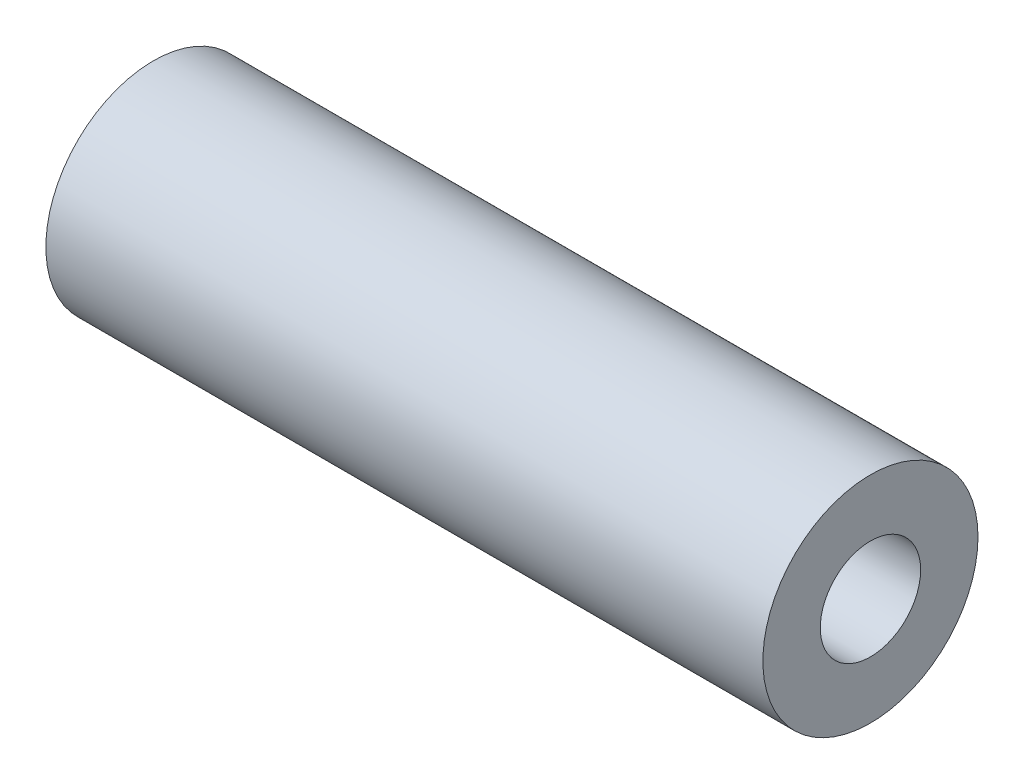
ISO-10303-21;
HEADER;
FILE_DESCRIPTION(('STEP AP214'),'2;1');
FILE_NAME('part.step','',(''),(''),'','','');
FILE_SCHEMA(('AUTOMOTIVE_DESIGN { 1 0 10303 214 1 1 1 1 }'));
ENDSEC;
DATA;
#1=APPLICATION_CONTEXT('core data for automotive mechanical design processes');
#2=APPLICATION_PROTOCOL_DEFINITION('international standard','automotive_design',2000,#1);
#3=PRODUCT_CONTEXT('',#1,'mechanical');
#4=PRODUCT('Part','Part','',(#3));
#5=PRODUCT_RELATED_PRODUCT_CATEGORY('part','',(#4));
#6=PRODUCT_DEFINITION_FORMATION('','',#4);
#7=PRODUCT_DEFINITION_CONTEXT('part definition',#1,'design');
#8=PRODUCT_DEFINITION('design','',#6,#7);
#9=PRODUCT_DEFINITION_SHAPE('','',#8);
#10=(LENGTH_UNIT() NAMED_UNIT(*) SI_UNIT(.MILLI.,.METRE.));
#11=(NAMED_UNIT(*) PLANE_ANGLE_UNIT() SI_UNIT($,.RADIAN.));
#12=(NAMED_UNIT(*) SI_UNIT($,.STERADIAN.) SOLID_ANGLE_UNIT());
#13=UNCERTAINTY_MEASURE_WITH_UNIT(LENGTH_MEASURE(1.E-05),#10,'distance_accuracy_value','');
#14=(GEOMETRIC_REPRESENTATION_CONTEXT(3) GLOBAL_UNCERTAINTY_ASSIGNED_CONTEXT((#13)) GLOBAL_UNIT_ASSIGNED_CONTEXT((#10,
#11,#12)) REPRESENTATION_CONTEXT('',''));
#15=CARTESIAN_POINT('',(0.,0.,0.));
#16=DIRECTION('',(0.,0.,1.));
#17=DIRECTION('',(1.,0.,0.));
#18=AXIS2_PLACEMENT_3D('',#15,#16,#17);
#19=CARTESIAN_POINT('',(30.,0.,0.));
#20=DIRECTION('',(1.,0.,0.));
#21=DIRECTION('',(0.,0.,-1.));
#22=AXIS2_PLACEMENT_3D('',#19,#20,#21);
#23=PLANE('',#22);
#24=CARTESIAN_POINT('',(30.,0.,0.));
#25=DIRECTION('',(1.,0.,0.));
#26=DIRECTION('',(0.,0.,-1.));
#27=AXIS2_PLACEMENT_3D('',#24,#25,#26);
#28=CIRCLE('',#27,4.5);
#29=CARTESIAN_POINT('',(30.,0.,-4.5));
#30=VERTEX_POINT('',#29);
#31=EDGE_CURVE('E10',#30,#30,#28,.T.);
#32=ORIENTED_EDGE('',*,*,#31,.T.);
#33=EDGE_LOOP('',(#32));
#34=FACE_BOUND('',#33,.T.);
#35=CARTESIAN_POINT('',(30.,0.,0.));
#36=DIRECTION('',(1.,0.,0.));
#37=DIRECTION('',(0.,0.,-1.));
#38=AXIS2_PLACEMENT_3D('',#35,#36,#37);
#39=CIRCLE('',#38,2.1);
#40=CARTESIAN_POINT('',(30.,0.,-2.1));
#41=VERTEX_POINT('',#40);
#42=EDGE_CURVE('E52',#41,#41,#39,.T.);
#43=ORIENTED_EDGE('',*,*,#42,.F.);
#44=EDGE_LOOP('',(#43));
#45=FACE_BOUND('',#44,.T.);
#46=ADVANCED_FACE('F41',(#34,#45),#23,.T.);
#47=CARTESIAN_POINT('',(0.,0.,0.));
#48=DIRECTION('',(1.,0.,0.));
#49=DIRECTION('',(0.,0.,-1.));
#50=AXIS2_PLACEMENT_3D('',#47,#48,#49);
#51=PLANE('',#50);
#52=CARTESIAN_POINT('',(0.,0.,0.));
#53=DIRECTION('',(1.,0.,0.));
#54=DIRECTION('',(0.,0.,-1.));
#55=AXIS2_PLACEMENT_3D('',#52,#53,#54);
#56=CIRCLE('',#55,4.5);
#57=CARTESIAN_POINT('',(0.,0.,-4.5));
#58=VERTEX_POINT('',#57);
#59=EDGE_CURVE('E45',#58,#58,#56,.T.);
#60=ORIENTED_EDGE('',*,*,#59,.F.);
#61=EDGE_LOOP('',(#60));
#62=FACE_BOUND('',#61,.T.);
#63=CARTESIAN_POINT('',(0.,0.,0.));
#64=DIRECTION('',(1.,0.,0.));
#65=DIRECTION('',(0.,0.,-1.));
#66=AXIS2_PLACEMENT_3D('',#63,#64,#65);
#67=CIRCLE('',#66,2.1);
#68=CARTESIAN_POINT('',(0.,0.,-2.1));
#69=VERTEX_POINT('',#68);
#70=EDGE_CURVE('E54',#69,#69,#67,.T.);
#71=ORIENTED_EDGE('',*,*,#70,.T.);
#72=EDGE_LOOP('',(#71));
#73=FACE_BOUND('',#72,.T.);
#74=ADVANCED_FACE('F64',(#62,#73),#51,.F.);
#75=CARTESIAN_POINT('',(30.,0.,0.));
#76=DIRECTION('',(-1.,0.,0.));
#77=DIRECTION('',(0.,0.,1.));
#78=AXIS2_PLACEMENT_3D('',#75,#76,#77);
#79=CYLINDRICAL_SURFACE('',#78,4.5);
#80=ORIENTED_EDGE('',*,*,#31,.F.);
#81=EDGE_LOOP('',(#80));
#82=FACE_BOUND('',#81,.T.);
#83=ORIENTED_EDGE('',*,*,#59,.T.);
#84=EDGE_LOOP('',(#83));
#85=FACE_BOUND('',#84,.T.);
#86=ADVANCED_FACE('F43',(#82,#85),#79,.T.);
#87=CARTESIAN_POINT('',(30.,0.,0.));
#88=DIRECTION('',(-1.,0.,0.));
#89=DIRECTION('',(0.,0.,1.));
#90=AXIS2_PLACEMENT_3D('',#87,#88,#89);
#91=CYLINDRICAL_SURFACE('',#90,2.1);
#92=ORIENTED_EDGE('',*,*,#42,.T.);
#93=EDGE_LOOP('',(#92));
#94=FACE_BOUND('',#93,.T.);
#95=ORIENTED_EDGE('',*,*,#70,.F.);
#96=EDGE_LOOP('',(#95));
#97=FACE_BOUND('',#96,.T.);
#98=ADVANCED_FACE('F60',(#94,#97),#91,.F.);
#99=CLOSED_SHELL('',(#46,#74,#86,#98));
#100=MANIFOLD_SOLID_BREP('B2',#99);
#101=ADVANCED_BREP_SHAPE_REPRESENTATION('',(#18,#100),#14);
#102=SHAPE_DEFINITION_REPRESENTATION(#9,#101);
ENDSEC;
END-ISO-10303-21;
